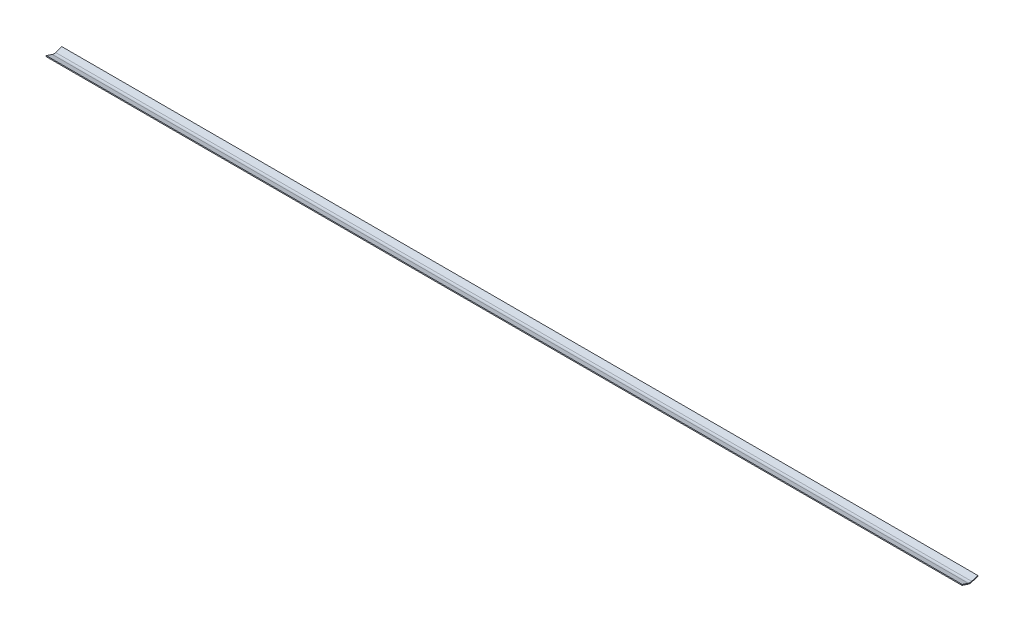
ISO-10303-21;
HEADER;
FILE_DESCRIPTION(('STEP AP214'),'2;1');
FILE_NAME('part.step','',(''),(''),'','','');
FILE_SCHEMA(('AUTOMOTIVE_DESIGN { 1 0 10303 214 1 1 1 1 }'));
ENDSEC;
DATA;
#1=APPLICATION_CONTEXT('core data for automotive mechanical design processes');
#2=APPLICATION_PROTOCOL_DEFINITION('international standard','automotive_design',2000,#1);
#3=PRODUCT_CONTEXT('',#1,'mechanical');
#4=PRODUCT('Part','Part','',(#3));
#5=PRODUCT_RELATED_PRODUCT_CATEGORY('part','',(#4));
#6=PRODUCT_DEFINITION_FORMATION('','',#4);
#7=PRODUCT_DEFINITION_CONTEXT('part definition',#1,'design');
#8=PRODUCT_DEFINITION('design','',#6,#7);
#9=PRODUCT_DEFINITION_SHAPE('','',#8);
#10=(LENGTH_UNIT() NAMED_UNIT(*) SI_UNIT(.MILLI.,.METRE.));
#11=(NAMED_UNIT(*) PLANE_ANGLE_UNIT() SI_UNIT($,.RADIAN.));
#12=(NAMED_UNIT(*) SI_UNIT($,.STERADIAN.) SOLID_ANGLE_UNIT());
#13=UNCERTAINTY_MEASURE_WITH_UNIT(LENGTH_MEASURE(1.E-05),#10,'distance_accuracy_value','');
#14=(GEOMETRIC_REPRESENTATION_CONTEXT(3) GLOBAL_UNCERTAINTY_ASSIGNED_CONTEXT((#13)) GLOBAL_UNIT_ASSIGNED_CONTEXT((#10,
#11,#12)) REPRESENTATION_CONTEXT('',''));
#15=CARTESIAN_POINT('',(0.,0.,0.));
#16=DIRECTION('',(0.,0.,1.));
#17=DIRECTION('',(1.,0.,0.));
#18=AXIS2_PLACEMENT_3D('',#15,#16,#17);
#19=CARTESIAN_POINT('',(1140.,1.65334887105103,4.84469669191699));
#20=DIRECTION('',(1.,0.,0.));
#21=DIRECTION('',(0.,0.,-1.));
#22=AXIS2_PLACEMENT_3D('',#19,#20,#21);
#23=PLANE('',#22);
#24=DIRECTION('',(0.,0.946405865397737,-0.322979779461132));
#25=VECTOR('',#24,1.);
#26=CARTESIAN_POINT('',(1140.,1.65334887105103,4.84469669191699));
#27=LINE('',#26,#25);
#28=CARTESIAN_POINT('',(1140.,1.65334887105103,4.84469669191699));
#29=VERTEX_POINT('',#28);
#30=CARTESIAN_POINT('',(1140.,3.54616060184651,4.19873713299472));
#31=VERTEX_POINT('',#30);
#32=EDGE_CURVE('E11',#29,#31,#27,.T.);
#33=ORIENTED_EDGE('',*,*,#32,.F.);
#34=CARTESIAN_POINT('',(1140.,15.8494368520171,0.));
#35=DIRECTION('',(1.,0.,0.));
#36=DIRECTION('',(0.,0.,-1.));
#37=AXIS2_PLACEMENT_3D('',#34,#35,#36);
#38=CIRCLE('',#37,15.);
#39=CARTESIAN_POINT('',(1140.,1.65334887105103,-4.84469669191697));
#40=VERTEX_POINT('',#39);
#41=EDGE_CURVE('E135',#40,#29,#38,.F.);
#42=ORIENTED_EDGE('',*,*,#41,.F.);
#43=DIRECTION('',(0.,-0.946405865397735,-0.322979779461137));
#44=VECTOR('',#43,1.);
#45=CARTESIAN_POINT('',(1140.,3.5461606018465,-4.1987371329947));
#46=LINE('',#45,#44);
#47=CARTESIAN_POINT('',(1140.,3.5461606018465,-4.1987371329947));
#48=VERTEX_POINT('',#47);
#49=EDGE_CURVE('E46',#48,#40,#46,.T.);
#50=ORIENTED_EDGE('',*,*,#49,.F.);
#51=CARTESIAN_POINT('',(1140.,15.8494368520171,0.));
#52=DIRECTION('',(1.,0.,0.));
#53=DIRECTION('',(0.,0.,-1.));
#54=AXIS2_PLACEMENT_3D('',#51,#52,#53);
#55=CIRCLE('',#54,13.);
#56=EDGE_CURVE('E128',#48,#31,#55,.F.);
#57=ORIENTED_EDGE('',*,*,#56,.T.);
#58=EDGE_LOOP('',(#33,#42,#50,#57));
#59=FACE_BOUND('',#58,.T.);
#60=ADVANCED_FACE('F38',(#59),#23,.T.);
#61=CARTESIAN_POINT('',(1140.,3.5461606018465,-4.1987371329947));
#62=DIRECTION('',(1.,0.,0.));
#63=DIRECTION('',(0.,0.,-1.));
#64=AXIS2_PLACEMENT_3D('',#61,#62,#63);
#65=PLANE('',#64);
#66=DIRECTION('',(0.,0.322979779461132,0.946405865397736));
#67=VECTOR('',#66,1.);
#68=CARTESIAN_POINT('',(1140.,0.,0.));
#69=LINE('',#68,#67);
#70=CARTESIAN_POINT('',(1140.,6.82539682539682,20.));
#71=VERTEX_POINT('',#70);
#72=EDGE_CURVE('E184',#29,#71,#69,.T.);
#73=ORIENTED_EDGE('',*,*,#72,.F.);
#74=ORIENTED_EDGE('',*,*,#32,.T.);
#75=DIRECTION('',(0.,0.322979779461132,0.946405865397737));
#76=VECTOR('',#75,1.);
#77=CARTESIAN_POINT('',(1140.,1.89281173079547,-0.645959558922264));
#78=LINE('',#77,#76);
#79=CARTESIAN_POINT('',(1140.,8.71820855619229,19.3540404410777));
#80=VERTEX_POINT('',#79);
#81=EDGE_CURVE('E94',#31,#80,#78,.T.);
#82=ORIENTED_EDGE('',*,*,#81,.T.);
#83=DIRECTION('',(0.,0.946405865397737,-0.32297977946113));
#84=VECTOR('',#83,1.);
#85=CARTESIAN_POINT('',(1140.,6.82539682539682,20.));
#86=LINE('',#85,#84);
#87=EDGE_CURVE('E341',#71,#80,#86,.T.);
#88=ORIENTED_EDGE('',*,*,#87,.F.);
#89=EDGE_LOOP('',(#73,#74,#82,#88));
#90=FACE_BOUND('',#89,.T.);
#91=ADVANCED_FACE('F192',(#90),#65,.T.);
#92=CARTESIAN_POINT('',(-1140.,1.65334887105103,-4.84469669191697));
#93=DIRECTION('',(-1.,0.,0.));
#94=DIRECTION('',(0.,0.,1.));
#95=AXIS2_PLACEMENT_3D('',#92,#93,#94);
#96=PLANE('',#95);
#97=DIRECTION('',(0.,0.946405865397735,0.322979779461137));
#98=VECTOR('',#97,1.);
#99=CARTESIAN_POINT('',(-1140.,1.65334887105103,-4.84469669191697));
#100=LINE('',#99,#98);
#101=CARTESIAN_POINT('',(-1140.,1.65334887105103,-4.84469669191697));
#102=VERTEX_POINT('',#101);
#103=CARTESIAN_POINT('',(-1140.,3.5461606018465,-4.1987371329947));
#104=VERTEX_POINT('',#103);
#105=EDGE_CURVE('E81',#102,#104,#100,.T.);
#106=ORIENTED_EDGE('',*,*,#105,.F.);
#107=CARTESIAN_POINT('',(-1140.,15.8494368520171,0.));
#108=DIRECTION('',(1.,0.,0.));
#109=DIRECTION('',(0.,0.,-1.));
#110=AXIS2_PLACEMENT_3D('',#107,#108,#109);
#111=CIRCLE('',#110,15.);
#112=CARTESIAN_POINT('',(-1140.,1.65334887105103,4.84469669191699));
#113=VERTEX_POINT('',#112);
#114=EDGE_CURVE('E150',#102,#113,#111,.F.);
#115=ORIENTED_EDGE('',*,*,#114,.T.);
#116=DIRECTION('',(0.,-0.946405865397737,0.322979779461132));
#117=VECTOR('',#116,1.);
#118=CARTESIAN_POINT('',(-1140.,3.54616060184651,4.19873713299472));
#119=LINE('',#118,#117);
#120=CARTESIAN_POINT('',(-1140.,3.54616060184651,4.19873713299472));
#121=VERTEX_POINT('',#120);
#122=EDGE_CURVE('E88',#121,#113,#119,.T.);
#123=ORIENTED_EDGE('',*,*,#122,.F.);
#124=CARTESIAN_POINT('',(-1140.,15.8494368520171,0.));
#125=DIRECTION('',(1.,0.,0.));
#126=DIRECTION('',(0.,0.,-1.));
#127=AXIS2_PLACEMENT_3D('',#124,#125,#126);
#128=CIRCLE('',#127,13.);
#129=EDGE_CURVE('E157',#104,#121,#128,.F.);
#130=ORIENTED_EDGE('',*,*,#129,.F.);
#131=EDGE_LOOP('',(#106,#115,#123,#130));
#132=FACE_BOUND('',#131,.T.);
#133=ADVANCED_FACE('F190',(#132),#96,.T.);
#134=CARTESIAN_POINT('',(-1140.,3.54616060184651,4.19873713299472));
#135=DIRECTION('',(-1.,0.,0.));
#136=DIRECTION('',(0.,0.,1.));
#137=AXIS2_PLACEMENT_3D('',#134,#135,#136);
#138=PLANE('',#137);
#139=DIRECTION('',(0.,-0.322979779461132,0.946405865397736));
#140=VECTOR('',#139,1.);
#141=CARTESIAN_POINT('',(-1140.,0.,0.));
#142=LINE('',#141,#140);
#143=CARTESIAN_POINT('',(-1140.,6.82539682539683,-20.));
#144=VERTEX_POINT('',#143);
#145=EDGE_CURVE('E152',#144,#102,#142,.T.);
#146=ORIENTED_EDGE('',*,*,#145,.T.);
#147=ORIENTED_EDGE('',*,*,#105,.T.);
#148=DIRECTION('',(0.,-0.322979779461132,0.946405865397736));
#149=VECTOR('',#148,1.);
#150=CARTESIAN_POINT('',(-1140.,1.89281173079547,0.645959558922265));
#151=LINE('',#150,#149);
#152=CARTESIAN_POINT('',(-1140.,8.7182085561923,-19.3540404410777));
#153=VERTEX_POINT('',#152);
#154=EDGE_CURVE('E155',#153,#104,#151,.T.);
#155=ORIENTED_EDGE('',*,*,#154,.F.);
#156=DIRECTION('',(0.,-0.946405865397737,-0.32297977946113));
#157=VECTOR('',#156,1.);
#158=CARTESIAN_POINT('',(-1140.,8.7182085561923,-19.3540404410777));
#159=LINE('',#158,#157);
#160=EDGE_CURVE('E116',#153,#144,#159,.T.);
#161=ORIENTED_EDGE('',*,*,#160,.T.);
#162=EDGE_LOOP('',(#146,#147,#155,#161));
#163=FACE_BOUND('',#162,.T.);
#164=ADVANCED_FACE('F186',(#163),#138,.T.);
#165=CARTESIAN_POINT('',(1140.,1.89281173079547,-0.645959558922264));
#166=DIRECTION('',(0.,-0.946405865397737,0.322979779461132));
#167=DIRECTION('',(0.,-0.322979779461132,-0.946405865397737));
#168=AXIS2_PLACEMENT_3D('',#165,#166,#167);
#169=PLANE('',#168);
#170=DIRECTION('',(0.,0.322979779461132,0.946405865397737));
#171=VECTOR('',#170,1.);
#172=CARTESIAN_POINT('',(-1140.,1.89281173079547,-0.645959558922264));
#173=LINE('',#172,#171);
#174=CARTESIAN_POINT('',(-1140.,8.71820855619229,19.3540404410777));
#175=VERTEX_POINT('',#174);
#176=EDGE_CURVE('E141',#121,#175,#173,.T.);
#177=ORIENTED_EDGE('',*,*,#176,.T.);
#178=DIRECTION('',(-1.,0.,0.));
#179=VECTOR('',#178,1.);
#180=CARTESIAN_POINT('',(1140.,8.71820855619229,19.3540404410777));
#181=LINE('',#180,#179);
#182=EDGE_CURVE('E171',#80,#175,#181,.T.);
#183=ORIENTED_EDGE('',*,*,#182,.F.);
#184=ORIENTED_EDGE('',*,*,#81,.F.);
#185=DIRECTION('',(-1.,0.,0.));
#186=VECTOR('',#185,1.);
#187=CARTESIAN_POINT('',(1140.,3.54616060184651,4.19873713299472));
#188=LINE('',#187,#186);
#189=EDGE_CURVE('E140',#31,#121,#188,.T.);
#190=ORIENTED_EDGE('',*,*,#189,.T.);
#191=EDGE_LOOP('',(#177,#183,#184,#190));
#192=FACE_BOUND('',#191,.T.);
#193=ADVANCED_FACE('F198',(#192),#169,.F.);
#194=CARTESIAN_POINT('',(1140.,6.82539682539682,20.));
#195=DIRECTION('',(0.,0.32297977946113,0.946405865397737));
#196=DIRECTION('',(0.,-0.946405865397737,0.32297977946113));
#197=AXIS2_PLACEMENT_3D('',#194,#195,#196);
#198=PLANE('',#197);
#199=DIRECTION('',(0.,0.946405865397737,-0.32297977946113));
#200=VECTOR('',#199,1.);
#201=CARTESIAN_POINT('',(-1140.,6.82539682539682,20.));
#202=LINE('',#201,#200);
#203=CARTESIAN_POINT('',(-1140.,6.82539682539682,20.));
#204=VERTEX_POINT('',#203);
#205=EDGE_CURVE('E144',#204,#175,#202,.T.);
#206=ORIENTED_EDGE('',*,*,#205,.F.);
#207=DIRECTION('',(-1.,0.,0.));
#208=VECTOR('',#207,1.);
#209=CARTESIAN_POINT('',(1140.,6.82539682539682,20.));
#210=LINE('',#209,#208);
#211=EDGE_CURVE('E169',#71,#204,#210,.T.);
#212=ORIENTED_EDGE('',*,*,#211,.F.);
#213=ORIENTED_EDGE('',*,*,#87,.T.);
#214=ORIENTED_EDGE('',*,*,#182,.T.);
#215=EDGE_LOOP('',(#206,#212,#213,#214));
#216=FACE_BOUND('',#215,.T.);
#217=ADVANCED_FACE('F229',(#216),#198,.T.);
#218=CARTESIAN_POINT('',(1140.,0.,0.));
#219=DIRECTION('',(0.,-0.946405865397736,0.322979779461132));
#220=DIRECTION('',(0.,-0.322979779461132,-0.946405865397737));
#221=AXIS2_PLACEMENT_3D('',#218,#219,#220);
#222=PLANE('',#221);
#223=DIRECTION('',(0.,0.322979779461132,0.946405865397736));
#224=VECTOR('',#223,1.);
#225=CARTESIAN_POINT('',(-1140.,0.,0.));
#226=LINE('',#225,#224);
#227=EDGE_CURVE('E147',#113,#204,#226,.T.);
#228=ORIENTED_EDGE('',*,*,#227,.F.);
#229=DIRECTION('',(-1.,0.,0.));
#230=VECTOR('',#229,1.);
#231=CARTESIAN_POINT('',(1140.,1.65334887105103,4.84469669191699));
#232=LINE('',#231,#230);
#233=EDGE_CURVE('E166',#29,#113,#232,.T.);
#234=ORIENTED_EDGE('',*,*,#233,.F.);
#235=ORIENTED_EDGE('',*,*,#72,.T.);
#236=ORIENTED_EDGE('',*,*,#211,.T.);
#237=EDGE_LOOP('',(#228,#234,#235,#236));
#238=FACE_BOUND('',#237,.T.);
#239=ADVANCED_FACE('F240',(#238),#222,.T.);
#240=CARTESIAN_POINT('',(1140.,15.8494368520171,0.));
#241=DIRECTION('',(-1.,0.,0.));
#242=DIRECTION('',(0.,0.,1.));
#243=AXIS2_PLACEMENT_3D('',#240,#241,#242);
#244=CYLINDRICAL_SURFACE('',#243,15.);
#245=ORIENTED_EDGE('',*,*,#114,.F.);
#246=DIRECTION('',(-1.,0.,0.));
#247=VECTOR('',#246,1.);
#248=CARTESIAN_POINT('',(1140.,1.65334887105103,-4.84469669191697));
#249=LINE('',#248,#247);
#250=EDGE_CURVE('E163',#40,#102,#249,.T.);
#251=ORIENTED_EDGE('',*,*,#250,.F.);
#252=ORIENTED_EDGE('',*,*,#41,.T.);
#253=ORIENTED_EDGE('',*,*,#233,.T.);
#254=EDGE_LOOP('',(#245,#251,#252,#253));
#255=FACE_BOUND('',#254,.T.);
#256=ADVANCED_FACE('F180',(#255),#244,.T.);
#257=CARTESIAN_POINT('',(1140.,0.,0.));
#258=DIRECTION('',(0.,-0.946405865397737,-0.322979779461132));
#259=DIRECTION('',(0.,0.322979779461132,-0.946405865397737));
#260=AXIS2_PLACEMENT_3D('',#257,#258,#259);
#261=PLANE('',#260);
#262=ORIENTED_EDGE('',*,*,#145,.F.);
#263=DIRECTION('',(-1.,0.,0.));
#264=VECTOR('',#263,1.);
#265=CARTESIAN_POINT('',(1140.,6.82539682539683,-20.));
#266=LINE('',#265,#264);
#267=CARTESIAN_POINT('',(1140.,6.82539682539683,-20.));
#268=VERTEX_POINT('',#267);
#269=EDGE_CURVE('E118',#268,#144,#266,.T.);
#270=ORIENTED_EDGE('',*,*,#269,.F.);
#271=DIRECTION('',(0.,-0.322979779461132,0.946405865397736));
#272=VECTOR('',#271,1.);
#273=CARTESIAN_POINT('',(1140.,0.,0.));
#274=LINE('',#273,#272);
#275=EDGE_CURVE('E133',#268,#40,#274,.T.);
#276=ORIENTED_EDGE('',*,*,#275,.T.);
#277=ORIENTED_EDGE('',*,*,#250,.T.);
#278=EDGE_LOOP('',(#262,#270,#276,#277));
#279=FACE_BOUND('',#278,.T.);
#280=ADVANCED_FACE('F185',(#279),#261,.T.);
#281=CARTESIAN_POINT('',(1140.,8.7182085561923,-19.3540404410777));
#282=DIRECTION('',(0.,0.32297977946113,-0.946405865397737));
#283=DIRECTION('',(0.,0.946405865397737,0.32297977946113));
#284=AXIS2_PLACEMENT_3D('',#281,#282,#283);
#285=PLANE('',#284);
#286=ORIENTED_EDGE('',*,*,#160,.F.);
#287=DIRECTION('',(-1.,0.,0.));
#288=VECTOR('',#287,1.);
#289=CARTESIAN_POINT('',(1140.,8.7182085561923,-19.3540404410777));
#290=LINE('',#289,#288);
#291=CARTESIAN_POINT('',(1140.,8.7182085561923,-19.3540404410777));
#292=VERTEX_POINT('',#291);
#293=EDGE_CURVE('E110',#292,#153,#290,.T.);
#294=ORIENTED_EDGE('',*,*,#293,.F.);
#295=DIRECTION('',(0.,-0.946405865397737,-0.32297977946113));
#296=VECTOR('',#295,1.);
#297=CARTESIAN_POINT('',(1140.,8.7182085561923,-19.3540404410777));
#298=LINE('',#297,#296);
#299=EDGE_CURVE('E114',#292,#268,#298,.T.);
#300=ORIENTED_EDGE('',*,*,#299,.T.);
#301=ORIENTED_EDGE('',*,*,#269,.T.);
#302=EDGE_LOOP('',(#286,#294,#300,#301));
#303=FACE_BOUND('',#302,.T.);
#304=ADVANCED_FACE('F112',(#303),#285,.T.);
#305=CARTESIAN_POINT('',(1140.,1.89281173079547,0.645959558922265));
#306=DIRECTION('',(0.,-0.946405865397736,-0.322979779461132));
#307=DIRECTION('',(0.,0.322979779461132,-0.946405865397737));
#308=AXIS2_PLACEMENT_3D('',#305,#306,#307);
#309=PLANE('',#308);
#310=ORIENTED_EDGE('',*,*,#154,.T.);
#311=DIRECTION('',(-1.,0.,0.));
#312=VECTOR('',#311,1.);
#313=CARTESIAN_POINT('',(1140.,3.5461606018465,-4.1987371329947));
#314=LINE('',#313,#312);
#315=EDGE_CURVE('E119',#48,#104,#314,.T.);
#316=ORIENTED_EDGE('',*,*,#315,.F.);
#317=DIRECTION('',(0.,-0.322979779461132,0.946405865397736));
#318=VECTOR('',#317,1.);
#319=CARTESIAN_POINT('',(1140.,1.89281173079547,0.645959558922265));
#320=LINE('',#319,#318);
#321=EDGE_CURVE('E123',#292,#48,#320,.T.);
#322=ORIENTED_EDGE('',*,*,#321,.F.);
#323=ORIENTED_EDGE('',*,*,#293,.T.);
#324=EDGE_LOOP('',(#310,#316,#322,#323));
#325=FACE_BOUND('',#324,.T.);
#326=ADVANCED_FACE('F124',(#325),#309,.F.);
#327=CARTESIAN_POINT('',(1140.,15.8494368520171,0.));
#328=DIRECTION('',(-1.,0.,0.));
#329=DIRECTION('',(0.,0.,1.));
#330=AXIS2_PLACEMENT_3D('',#327,#328,#329);
#331=CYLINDRICAL_SURFACE('',#330,13.);
#332=ORIENTED_EDGE('',*,*,#129,.T.);
#333=ORIENTED_EDGE('',*,*,#189,.F.);
#334=ORIENTED_EDGE('',*,*,#56,.F.);
#335=ORIENTED_EDGE('',*,*,#315,.T.);
#336=EDGE_LOOP('',(#332,#333,#334,#335));
#337=FACE_BOUND('',#336,.T.);
#338=ADVANCED_FACE('F188',(#337),#331,.F.);
#339=CARTESIAN_POINT('',(1140.,15.8494368520171,0.));
#340=DIRECTION('',(1.,0.,0.));
#341=DIRECTION('',(0.,0.,-1.));
#342=AXIS2_PLACEMENT_3D('',#339,#340,#341);
#343=PLANE('',#342);
#344=ORIENTED_EDGE('',*,*,#321,.T.);
#345=ORIENTED_EDGE('',*,*,#49,.T.);
#346=ORIENTED_EDGE('',*,*,#275,.F.);
#347=ORIENTED_EDGE('',*,*,#299,.F.);
#348=EDGE_LOOP('',(#344,#345,#346,#347));
#349=FACE_BOUND('',#348,.T.);
#350=ADVANCED_FACE('F131',(#349),#343,.T.);
#351=CARTESIAN_POINT('',(-1140.,15.8494368520171,0.));
#352=DIRECTION('',(1.,0.,0.));
#353=DIRECTION('',(0.,0.,-1.));
#354=AXIS2_PLACEMENT_3D('',#351,#352,#353);
#355=PLANE('',#354);
#356=ORIENTED_EDGE('',*,*,#176,.F.);
#357=ORIENTED_EDGE('',*,*,#122,.T.);
#358=ORIENTED_EDGE('',*,*,#227,.T.);
#359=ORIENTED_EDGE('',*,*,#205,.T.);
#360=EDGE_LOOP('',(#356,#357,#358,#359));
#361=FACE_BOUND('',#360,.T.);
#362=ADVANCED_FACE('F306',(#361),#355,.F.);
#363=CLOSED_SHELL('',(#60,#91,#133,#164,#193,#217,#239,#256,#280,#304,#326,#338,#350,#362));
#364=MANIFOLD_SOLID_BREP('B2',#363);
#365=ADVANCED_BREP_SHAPE_REPRESENTATION('',(#18,#364),#14);
#366=SHAPE_DEFINITION_REPRESENTATION(#9,#365);
ENDSEC;
END-ISO-10303-21;
